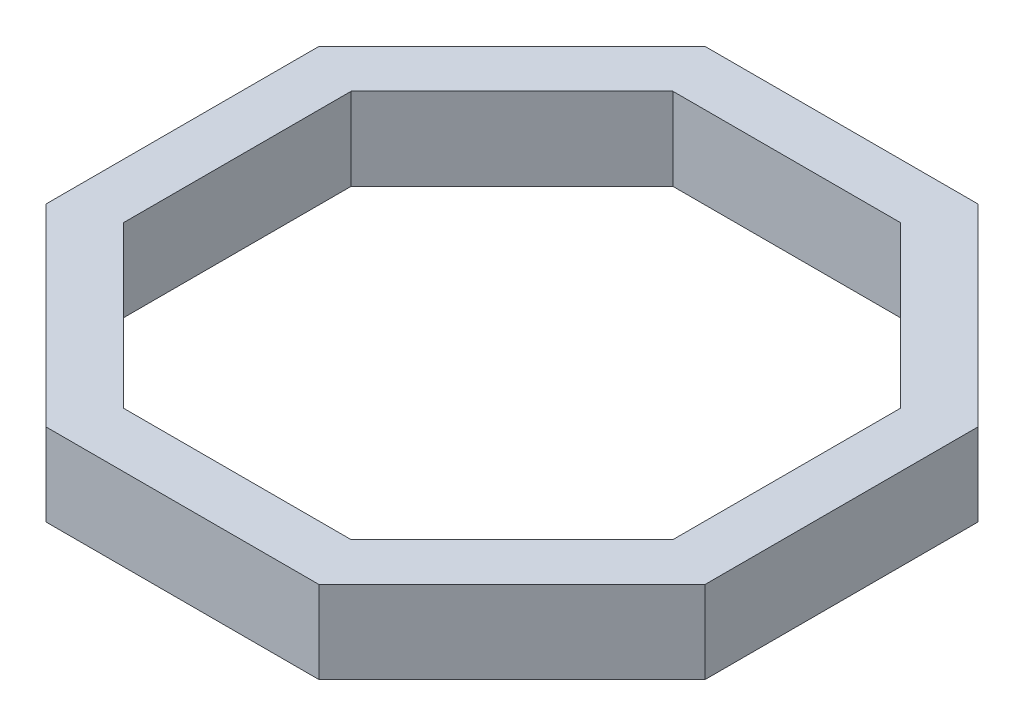
ISO-10303-21;
HEADER;
FILE_DESCRIPTION(('STEP AP214'),'2;1');
FILE_NAME('part.step','',(''),(''),'','','');
FILE_SCHEMA(('AUTOMOTIVE_DESIGN { 1 0 10303 214 1 1 1 1 }'));
ENDSEC;
DATA;
#1=APPLICATION_CONTEXT('core data for automotive mechanical design processes');
#2=APPLICATION_PROTOCOL_DEFINITION('international standard','automotive_design',2000,#1);
#3=PRODUCT_CONTEXT('',#1,'mechanical');
#4=PRODUCT('Part','Part','',(#3));
#5=PRODUCT_RELATED_PRODUCT_CATEGORY('part','',(#4));
#6=PRODUCT_DEFINITION_FORMATION('','',#4);
#7=PRODUCT_DEFINITION_CONTEXT('part definition',#1,'design');
#8=PRODUCT_DEFINITION('design','',#6,#7);
#9=PRODUCT_DEFINITION_SHAPE('','',#8);
#10=(LENGTH_UNIT() NAMED_UNIT(*) SI_UNIT(.MILLI.,.METRE.));
#11=(NAMED_UNIT(*) PLANE_ANGLE_UNIT() SI_UNIT($,.RADIAN.));
#12=(NAMED_UNIT(*) SI_UNIT($,.STERADIAN.) SOLID_ANGLE_UNIT());
#13=UNCERTAINTY_MEASURE_WITH_UNIT(LENGTH_MEASURE(1.E-05),#10,'distance_accuracy_value','');
#14=(GEOMETRIC_REPRESENTATION_CONTEXT(3) GLOBAL_UNCERTAINTY_ASSIGNED_CONTEXT((#13)) GLOBAL_UNIT_ASSIGNED_CONTEXT((#10,
#11,#12)) REPRESENTATION_CONTEXT('',''));
#15=CARTESIAN_POINT('',(0.,0.,0.));
#16=DIRECTION('',(0.,0.,1.));
#17=DIRECTION('',(1.,0.,0.));
#18=AXIS2_PLACEMENT_3D('',#15,#16,#17);
#19=CARTESIAN_POINT('',(120.,30.,49.7056274847712));
#20=DIRECTION('',(-1.,0.,0.));
#21=DIRECTION('',(0.,0.,1.));
#22=AXIS2_PLACEMENT_3D('',#19,#20,#21);
#23=PLANE('',#22);
#24=DIRECTION('',(0.,0.,-1.));
#25=VECTOR('',#24,1.);
#26=CARTESIAN_POINT('',(120.,0.,49.7056274847712));
#27=LINE('',#26,#25);
#28=CARTESIAN_POINT('',(120.,0.,49.7056274847712));
#29=VERTEX_POINT('',#28);
#30=CARTESIAN_POINT('',(120.,0.,-49.7056274847715));
#31=VERTEX_POINT('',#30);
#32=EDGE_CURVE('E204',#29,#31,#27,.T.);
#33=ORIENTED_EDGE('',*,*,#32,.T.);
#34=DIRECTION('',(0.,-1.,0.));
#35=VECTOR('',#34,1.);
#36=CARTESIAN_POINT('',(120.,30.,-49.7056274847715));
#37=LINE('',#36,#35);
#38=CARTESIAN_POINT('',(120.,30.,-49.7056274847715));
#39=VERTEX_POINT('',#38);
#40=EDGE_CURVE('E11',#39,#31,#37,.T.);
#41=ORIENTED_EDGE('',*,*,#40,.F.);
#42=DIRECTION('',(0.,0.,-1.));
#43=VECTOR('',#42,1.);
#44=CARTESIAN_POINT('',(120.,30.,49.7056274847712));
#45=LINE('',#44,#43);
#46=CARTESIAN_POINT('',(120.,30.,49.7056274847712));
#47=VERTEX_POINT('',#46);
#48=EDGE_CURVE('E216',#47,#39,#45,.T.);
#49=ORIENTED_EDGE('',*,*,#48,.F.);
#50=DIRECTION('',(0.,-1.,0.));
#51=VECTOR('',#50,1.);
#52=CARTESIAN_POINT('',(120.,30.,49.7056274847712));
#53=LINE('',#52,#51);
#54=EDGE_CURVE('E234',#47,#29,#53,.T.);
#55=ORIENTED_EDGE('',*,*,#54,.T.);
#56=EDGE_LOOP('',(#33,#41,#49,#55));
#57=FACE_BOUND('',#56,.T.);
#58=ADVANCED_FACE('F35',(#57),#23,.F.);
#59=CARTESIAN_POINT('',(120.,30.,-49.7056274847715));
#60=DIRECTION('',(-0.707106781186546,0.,0.707106781186549));
#61=DIRECTION('',(0.707106781186549,0.,0.707106781186546));
#62=AXIS2_PLACEMENT_3D('',#59,#60,#61);
#63=PLANE('',#62);
#64=DIRECTION('',(-0.707106781186549,0.,-0.707106781186546));
#65=VECTOR('',#64,1.);
#66=CARTESIAN_POINT('',(120.,0.,-49.7056274847715));
#67=LINE('',#66,#65);
#68=CARTESIAN_POINT('',(49.7056274847711,0.,-120.));
#69=VERTEX_POINT('',#68);
#70=EDGE_CURVE('E237',#31,#69,#67,.T.);
#71=ORIENTED_EDGE('',*,*,#70,.T.);
#72=DIRECTION('',(0.,-1.,0.));
#73=VECTOR('',#72,1.);
#74=CARTESIAN_POINT('',(49.7056274847711,30.,-120.));
#75=LINE('',#74,#73);
#76=CARTESIAN_POINT('',(49.7056274847711,30.,-120.));
#77=VERTEX_POINT('',#76);
#78=EDGE_CURVE('E42',#77,#69,#75,.T.);
#79=ORIENTED_EDGE('',*,*,#78,.F.);
#80=DIRECTION('',(-0.707106781186549,0.,-0.707106781186546));
#81=VECTOR('',#80,1.);
#82=CARTESIAN_POINT('',(120.,30.,-49.7056274847715));
#83=LINE('',#82,#81);
#84=EDGE_CURVE('E219',#39,#77,#83,.T.);
#85=ORIENTED_EDGE('',*,*,#84,.F.);
#86=ORIENTED_EDGE('',*,*,#40,.T.);
#87=EDGE_LOOP('',(#71,#79,#85,#86));
#88=FACE_BOUND('',#87,.T.);
#89=ADVANCED_FACE('F292',(#88),#63,.F.);
#90=CARTESIAN_POINT('',(49.7056274847711,30.,-120.));
#91=DIRECTION('',(0.,0.,1.));
#92=DIRECTION('',(1.,0.,0.));
#93=AXIS2_PLACEMENT_3D('',#90,#91,#92);
#94=PLANE('',#93);
#95=DIRECTION('',(-1.,0.,0.));
#96=VECTOR('',#95,1.);
#97=CARTESIAN_POINT('',(49.7056274847711,0.,-120.));
#98=LINE('',#97,#96);
#99=CARTESIAN_POINT('',(-49.7056274847715,0.,-120.));
#100=VERTEX_POINT('',#99);
#101=EDGE_CURVE('E239',#69,#100,#98,.T.);
#102=ORIENTED_EDGE('',*,*,#101,.T.);
#103=DIRECTION('',(0.,-1.,0.));
#104=VECTOR('',#103,1.);
#105=CARTESIAN_POINT('',(-49.7056274847715,30.,-120.));
#106=LINE('',#105,#104);
#107=CARTESIAN_POINT('',(-49.7056274847715,30.,-120.));
#108=VERTEX_POINT('',#107);
#109=EDGE_CURVE('E264',#108,#100,#106,.T.);
#110=ORIENTED_EDGE('',*,*,#109,.F.);
#111=DIRECTION('',(-1.,0.,0.));
#112=VECTOR('',#111,1.);
#113=CARTESIAN_POINT('',(49.7056274847711,30.,-120.));
#114=LINE('',#113,#112);
#115=EDGE_CURVE('E222',#77,#108,#114,.T.);
#116=ORIENTED_EDGE('',*,*,#115,.F.);
#117=ORIENTED_EDGE('',*,*,#78,.T.);
#118=EDGE_LOOP('',(#102,#110,#116,#117));
#119=FACE_BOUND('',#118,.T.);
#120=ADVANCED_FACE('F271',(#119),#94,.F.);
#121=CARTESIAN_POINT('',(-49.7056274847715,30.,-120.));
#122=DIRECTION('',(0.707106781186548,0.,0.707106781186547));
#123=DIRECTION('',(0.707106781186547,0.,-0.707106781186548));
#124=AXIS2_PLACEMENT_3D('',#121,#122,#123);
#125=PLANE('',#124);
#126=DIRECTION('',(-0.707106781186547,0.,0.707106781186549));
#127=VECTOR('',#126,1.);
#128=CARTESIAN_POINT('',(-49.7056274847715,0.,-120.));
#129=LINE('',#128,#127);
#130=CARTESIAN_POINT('',(-120.,0.,-49.7056274847711));
#131=VERTEX_POINT('',#130);
#132=EDGE_CURVE('E241',#100,#131,#129,.T.);
#133=ORIENTED_EDGE('',*,*,#132,.T.);
#134=DIRECTION('',(0.,-1.,0.));
#135=VECTOR('',#134,1.);
#136=CARTESIAN_POINT('',(-120.,30.,-49.7056274847711));
#137=LINE('',#136,#135);
#138=CARTESIAN_POINT('',(-120.,30.,-49.7056274847711));
#139=VERTEX_POINT('',#138);
#140=EDGE_CURVE('E261',#139,#131,#137,.T.);
#141=ORIENTED_EDGE('',*,*,#140,.F.);
#142=DIRECTION('',(-0.707106781186547,0.,0.707106781186549));
#143=VECTOR('',#142,1.);
#144=CARTESIAN_POINT('',(-49.7056274847715,30.,-120.));
#145=LINE('',#144,#143);
#146=EDGE_CURVE('E224',#108,#139,#145,.T.);
#147=ORIENTED_EDGE('',*,*,#146,.F.);
#148=ORIENTED_EDGE('',*,*,#109,.T.);
#149=EDGE_LOOP('',(#133,#141,#147,#148));
#150=FACE_BOUND('',#149,.T.);
#151=ADVANCED_FACE('F280',(#150),#125,.F.);
#152=CARTESIAN_POINT('',(-120.,30.,-49.7056274847711));
#153=DIRECTION('',(1.,0.,0.));
#154=DIRECTION('',(0.,0.,-1.));
#155=AXIS2_PLACEMENT_3D('',#152,#153,#154);
#156=PLANE('',#155);
#157=DIRECTION('',(0.,0.,1.));
#158=VECTOR('',#157,1.);
#159=CARTESIAN_POINT('',(-120.,0.,-49.7056274847711));
#160=LINE('',#159,#158);
#161=CARTESIAN_POINT('',(-120.,0.,49.7056274847715));
#162=VERTEX_POINT('',#161);
#163=EDGE_CURVE('E243',#131,#162,#160,.T.);
#164=ORIENTED_EDGE('',*,*,#163,.T.);
#165=DIRECTION('',(0.,-1.,0.));
#166=VECTOR('',#165,1.);
#167=CARTESIAN_POINT('',(-120.,30.,49.7056274847715));
#168=LINE('',#167,#166);
#169=CARTESIAN_POINT('',(-120.,30.,49.7056274847715));
#170=VERTEX_POINT('',#169);
#171=EDGE_CURVE('E258',#170,#162,#168,.T.);
#172=ORIENTED_EDGE('',*,*,#171,.F.);
#173=DIRECTION('',(0.,0.,1.));
#174=VECTOR('',#173,1.);
#175=CARTESIAN_POINT('',(-120.,30.,-49.7056274847711));
#176=LINE('',#175,#174);
#177=EDGE_CURVE('E226',#139,#170,#176,.T.);
#178=ORIENTED_EDGE('',*,*,#177,.F.);
#179=ORIENTED_EDGE('',*,*,#140,.T.);
#180=EDGE_LOOP('',(#164,#172,#178,#179));
#181=FACE_BOUND('',#180,.T.);
#182=ADVANCED_FACE('F284',(#181),#156,.F.);
#183=CARTESIAN_POINT('',(-120.,30.,49.7056274847715));
#184=DIRECTION('',(0.707106781186547,0.,-0.707106781186549));
#185=DIRECTION('',(-0.707106781186549,0.,-0.707106781186547));
#186=AXIS2_PLACEMENT_3D('',#183,#184,#185);
#187=PLANE('',#186);
#188=DIRECTION('',(0.707106781186548,0.,0.707106781186547));
#189=VECTOR('',#188,1.);
#190=CARTESIAN_POINT('',(-120.,0.,49.7056274847715));
#191=LINE('',#190,#189);
#192=CARTESIAN_POINT('',(-49.7056274847711,0.,120.));
#193=VERTEX_POINT('',#192);
#194=EDGE_CURVE('E245',#162,#193,#191,.T.);
#195=ORIENTED_EDGE('',*,*,#194,.T.);
#196=DIRECTION('',(0.,-1.,0.));
#197=VECTOR('',#196,1.);
#198=CARTESIAN_POINT('',(-49.7056274847711,30.,120.));
#199=LINE('',#198,#197);
#200=CARTESIAN_POINT('',(-49.7056274847711,30.,120.));
#201=VERTEX_POINT('',#200);
#202=EDGE_CURVE('E255',#201,#193,#199,.T.);
#203=ORIENTED_EDGE('',*,*,#202,.F.);
#204=DIRECTION('',(0.707106781186548,0.,0.707106781186547));
#205=VECTOR('',#204,1.);
#206=CARTESIAN_POINT('',(-120.,30.,49.7056274847715));
#207=LINE('',#206,#205);
#208=EDGE_CURVE('E228',#170,#201,#207,.T.);
#209=ORIENTED_EDGE('',*,*,#208,.F.);
#210=ORIENTED_EDGE('',*,*,#171,.T.);
#211=EDGE_LOOP('',(#195,#203,#209,#210));
#212=FACE_BOUND('',#211,.T.);
#213=ADVANCED_FACE('F305',(#212),#187,.F.);
#214=CARTESIAN_POINT('',(-49.7056274847711,30.,120.));
#215=DIRECTION('',(0.,0.,-1.));
#216=DIRECTION('',(-1.,0.,0.));
#217=AXIS2_PLACEMENT_3D('',#214,#215,#216);
#218=PLANE('',#217);
#219=DIRECTION('',(1.,0.,0.));
#220=VECTOR('',#219,1.);
#221=CARTESIAN_POINT('',(-49.7056274847711,0.,120.));
#222=LINE('',#221,#220);
#223=CARTESIAN_POINT('',(49.7056274847715,0.,120.));
#224=VERTEX_POINT('',#223);
#225=EDGE_CURVE('E247',#193,#224,#222,.T.);
#226=ORIENTED_EDGE('',*,*,#225,.T.);
#227=DIRECTION('',(0.,-1.,0.));
#228=VECTOR('',#227,1.);
#229=CARTESIAN_POINT('',(49.7056274847715,30.,120.));
#230=LINE('',#229,#228);
#231=CARTESIAN_POINT('',(49.7056274847715,30.,120.));
#232=VERTEX_POINT('',#231);
#233=EDGE_CURVE('E252',#232,#224,#230,.T.);
#234=ORIENTED_EDGE('',*,*,#233,.F.);
#235=DIRECTION('',(1.,0.,0.));
#236=VECTOR('',#235,1.);
#237=CARTESIAN_POINT('',(-49.7056274847711,30.,120.));
#238=LINE('',#237,#236);
#239=EDGE_CURVE('E230',#201,#232,#238,.T.);
#240=ORIENTED_EDGE('',*,*,#239,.F.);
#241=ORIENTED_EDGE('',*,*,#202,.T.);
#242=EDGE_LOOP('',(#226,#234,#240,#241));
#243=FACE_BOUND('',#242,.T.);
#244=ADVANCED_FACE('F303',(#243),#218,.F.);
#245=CARTESIAN_POINT('',(49.7056274847715,30.,120.));
#246=DIRECTION('',(-0.707106781186548,0.,-0.707106781186547));
#247=DIRECTION('',(-0.707106781186547,0.,0.707106781186548));
#248=AXIS2_PLACEMENT_3D('',#245,#246,#247);
#249=PLANE('',#248);
#250=DIRECTION('',(0.707106781186547,0.,-0.707106781186548));
#251=VECTOR('',#250,1.);
#252=CARTESIAN_POINT('',(49.7056274847715,0.,120.));
#253=LINE('',#252,#251);
#254=EDGE_CURVE('E220',#224,#29,#253,.T.);
#255=ORIENTED_EDGE('',*,*,#254,.T.);
#256=ORIENTED_EDGE('',*,*,#54,.F.);
#257=DIRECTION('',(0.707106781186547,0.,-0.707106781186548));
#258=VECTOR('',#257,1.);
#259=CARTESIAN_POINT('',(49.7056274847715,30.,120.));
#260=LINE('',#259,#258);
#261=EDGE_CURVE('E232',#232,#47,#260,.T.);
#262=ORIENTED_EDGE('',*,*,#261,.F.);
#263=ORIENTED_EDGE('',*,*,#233,.T.);
#264=EDGE_LOOP('',(#255,#256,#262,#263));
#265=FACE_BOUND('',#264,.T.);
#266=ADVANCED_FACE('F298',(#265),#249,.F.);
#267=CARTESIAN_POINT('',(0.,30.,0.));
#268=DIRECTION('',(0.,1.,0.));
#269=DIRECTION('',(0.,0.,1.));
#270=AXIS2_PLACEMENT_3D('',#267,#268,#269);
#271=PLANE('',#270);
#272=DIRECTION('',(0.,0.,-1.));
#273=VECTOR('',#272,1.);
#274=CARTESIAN_POINT('',(99.9999999999998,30.,41.4213562373093));
#275=LINE('',#274,#273);
#276=CARTESIAN_POINT('',(99.9999999999998,30.,41.4213562373093));
#277=VERTEX_POINT('',#276);
#278=CARTESIAN_POINT('',(99.9999999999997,30.,-41.4213562373095));
#279=VERTEX_POINT('',#278);
#280=EDGE_CURVE('E49',#277,#279,#275,.T.);
#281=ORIENTED_EDGE('',*,*,#280,.F.);
#282=DIRECTION('',(0.707106781186547,0.,-0.707106781186548));
#283=VECTOR('',#282,1.);
#284=CARTESIAN_POINT('',(41.4213562373095,30.,99.9999999999997));
#285=LINE('',#284,#283);
#286=CARTESIAN_POINT('',(41.4213562373095,30.,99.9999999999997));
#287=VERTEX_POINT('',#286);
#288=EDGE_CURVE('E166',#287,#277,#285,.T.);
#289=ORIENTED_EDGE('',*,*,#288,.F.);
#290=DIRECTION('',(1.,0.,0.));
#291=VECTOR('',#290,1.);
#292=CARTESIAN_POINT('',(-41.4213562373093,30.,99.9999999999998));
#293=LINE('',#292,#291);
#294=CARTESIAN_POINT('',(-41.4213562373093,30.,99.9999999999998));
#295=VERTEX_POINT('',#294);
#296=EDGE_CURVE('E169',#295,#287,#293,.T.);
#297=ORIENTED_EDGE('',*,*,#296,.F.);
#298=DIRECTION('',(0.707106781186548,0.,0.707106781186547));
#299=VECTOR('',#298,1.);
#300=CARTESIAN_POINT('',(-99.9999999999997,30.,41.4213562373095));
#301=LINE('',#300,#299);
#302=CARTESIAN_POINT('',(-99.9999999999997,30.,41.4213562373095));
#303=VERTEX_POINT('',#302);
#304=EDGE_CURVE('E197',#303,#295,#301,.T.);
#305=ORIENTED_EDGE('',*,*,#304,.F.);
#306=DIRECTION('',(0.,0.,1.));
#307=VECTOR('',#306,1.);
#308=CARTESIAN_POINT('',(-99.9999999999998,30.,-41.4213562373093));
#309=LINE('',#308,#307);
#310=CARTESIAN_POINT('',(-99.9999999999998,30.,-41.4213562373093));
#311=VERTEX_POINT('',#310);
#312=EDGE_CURVE('E194',#311,#303,#309,.T.);
#313=ORIENTED_EDGE('',*,*,#312,.F.);
#314=DIRECTION('',(-0.707106781186547,0.,0.707106781186548));
#315=VECTOR('',#314,1.);
#316=CARTESIAN_POINT('',(-41.4213562373095,30.,-99.9999999999997));
#317=LINE('',#316,#315);
#318=CARTESIAN_POINT('',(-41.4213562373095,30.,-99.9999999999997));
#319=VERTEX_POINT('',#318);
#320=EDGE_CURVE('E191',#319,#311,#317,.T.);
#321=ORIENTED_EDGE('',*,*,#320,.F.);
#322=DIRECTION('',(-1.,0.,0.));
#323=VECTOR('',#322,1.);
#324=CARTESIAN_POINT('',(41.4213562373093,30.,-99.9999999999998));
#325=LINE('',#324,#323);
#326=CARTESIAN_POINT('',(41.4213562373093,30.,-99.9999999999998));
#327=VERTEX_POINT('',#326);
#328=EDGE_CURVE('E188',#327,#319,#325,.T.);
#329=ORIENTED_EDGE('',*,*,#328,.F.);
#330=DIRECTION('',(-0.707106781186548,0.,-0.707106781186547));
#331=VECTOR('',#330,1.);
#332=CARTESIAN_POINT('',(99.9999999999997,30.,-41.4213562373095));
#333=LINE('',#332,#331);
#334=EDGE_CURVE('E186',#279,#327,#333,.T.);
#335=ORIENTED_EDGE('',*,*,#334,.F.);
#336=EDGE_LOOP('',(#281,#289,#297,#305,#313,#321,#329,#335));
#337=FACE_BOUND('',#336,.T.);
#338=ORIENTED_EDGE('',*,*,#48,.T.);
#339=ORIENTED_EDGE('',*,*,#84,.T.);
#340=ORIENTED_EDGE('',*,*,#115,.T.);
#341=ORIENTED_EDGE('',*,*,#146,.T.);
#342=ORIENTED_EDGE('',*,*,#177,.T.);
#343=ORIENTED_EDGE('',*,*,#208,.T.);
#344=ORIENTED_EDGE('',*,*,#239,.T.);
#345=ORIENTED_EDGE('',*,*,#261,.T.);
#346=EDGE_LOOP('',(#338,#339,#340,#341,#342,#343,#344,#345));
#347=FACE_BOUND('',#346,.T.);
#348=ADVANCED_FACE('F288',(#337,#347),#271,.T.);
#349=CARTESIAN_POINT('',(0.,0.,0.));
#350=DIRECTION('',(0.,1.,0.));
#351=DIRECTION('',(0.,0.,1.));
#352=AXIS2_PLACEMENT_3D('',#349,#350,#351);
#353=PLANE('',#352);
#354=DIRECTION('',(0.707106781186547,0.,-0.707106781186548));
#355=VECTOR('',#354,1.);
#356=CARTESIAN_POINT('',(41.4213562373095,0.,99.9999999999997));
#357=LINE('',#356,#355);
#358=CARTESIAN_POINT('',(41.4213562373095,0.,99.9999999999997));
#359=VERTEX_POINT('',#358);
#360=CARTESIAN_POINT('',(99.9999999999998,0.,41.4213562373093));
#361=VERTEX_POINT('',#360);
#362=EDGE_CURVE('E155',#359,#361,#357,.T.);
#363=ORIENTED_EDGE('',*,*,#362,.T.);
#364=DIRECTION('',(0.,0.,-1.));
#365=VECTOR('',#364,1.);
#366=CARTESIAN_POINT('',(99.9999999999998,0.,41.4213562373093));
#367=LINE('',#366,#365);
#368=CARTESIAN_POINT('',(99.9999999999997,0.,-41.4213562373095));
#369=VERTEX_POINT('',#368);
#370=EDGE_CURVE('E149',#361,#369,#367,.T.);
#371=ORIENTED_EDGE('',*,*,#370,.T.);
#372=DIRECTION('',(-0.707106781186548,0.,-0.707106781186547));
#373=VECTOR('',#372,1.);
#374=CARTESIAN_POINT('',(99.9999999999997,0.,-41.4213562373095));
#375=LINE('',#374,#373);
#376=CARTESIAN_POINT('',(41.4213562373093,0.,-99.9999999999998));
#377=VERTEX_POINT('',#376);
#378=EDGE_CURVE('E158',#369,#377,#375,.T.);
#379=ORIENTED_EDGE('',*,*,#378,.T.);
#380=DIRECTION('',(-1.,0.,0.));
#381=VECTOR('',#380,1.);
#382=CARTESIAN_POINT('',(41.4213562373093,0.,-99.9999999999998));
#383=LINE('',#382,#381);
#384=CARTESIAN_POINT('',(-41.4213562373095,0.,-99.9999999999997));
#385=VERTEX_POINT('',#384);
#386=EDGE_CURVE('E57',#377,#385,#383,.T.);
#387=ORIENTED_EDGE('',*,*,#386,.T.);
#388=DIRECTION('',(-0.707106781186547,0.,0.707106781186548));
#389=VECTOR('',#388,1.);
#390=CARTESIAN_POINT('',(-41.4213562373095,0.,-99.9999999999997));
#391=LINE('',#390,#389);
#392=CARTESIAN_POINT('',(-99.9999999999998,0.,-41.4213562373093));
#393=VERTEX_POINT('',#392);
#394=EDGE_CURVE('E173',#385,#393,#391,.T.);
#395=ORIENTED_EDGE('',*,*,#394,.T.);
#396=DIRECTION('',(0.,0.,1.));
#397=VECTOR('',#396,1.);
#398=CARTESIAN_POINT('',(-99.9999999999998,0.,-41.4213562373093));
#399=LINE('',#398,#397);
#400=CARTESIAN_POINT('',(-99.9999999999997,0.,41.4213562373095));
#401=VERTEX_POINT('',#400);
#402=EDGE_CURVE('E176',#393,#401,#399,.T.);
#403=ORIENTED_EDGE('',*,*,#402,.T.);
#404=DIRECTION('',(0.707106781186548,0.,0.707106781186547));
#405=VECTOR('',#404,1.);
#406=CARTESIAN_POINT('',(-99.9999999999997,0.,41.4213562373095));
#407=LINE('',#406,#405);
#408=CARTESIAN_POINT('',(-41.4213562373093,0.,99.9999999999998));
#409=VERTEX_POINT('',#408);
#410=EDGE_CURVE('E179',#401,#409,#407,.T.);
#411=ORIENTED_EDGE('',*,*,#410,.T.);
#412=DIRECTION('',(1.,0.,0.));
#413=VECTOR('',#412,1.);
#414=CARTESIAN_POINT('',(-41.4213562373093,0.,99.9999999999998));
#415=LINE('',#414,#413);
#416=EDGE_CURVE('E182',#409,#359,#415,.T.);
#417=ORIENTED_EDGE('',*,*,#416,.T.);
#418=EDGE_LOOP('',(#363,#371,#379,#387,#395,#403,#411,#417));
#419=FACE_BOUND('',#418,.T.);
#420=ORIENTED_EDGE('',*,*,#32,.F.);
#421=ORIENTED_EDGE('',*,*,#254,.F.);
#422=ORIENTED_EDGE('',*,*,#225,.F.);
#423=ORIENTED_EDGE('',*,*,#194,.F.);
#424=ORIENTED_EDGE('',*,*,#163,.F.);
#425=ORIENTED_EDGE('',*,*,#132,.F.);
#426=ORIENTED_EDGE('',*,*,#101,.F.);
#427=ORIENTED_EDGE('',*,*,#70,.F.);
#428=EDGE_LOOP('',(#420,#421,#422,#423,#424,#425,#426,#427));
#429=FACE_BOUND('',#428,.T.);
#430=ADVANCED_FACE('F162',(#419,#429),#353,.F.);
#431=CARTESIAN_POINT('',(99.9999999999998,0.,41.4213562373093));
#432=DIRECTION('',(1.,0.,0.));
#433=DIRECTION('',(0.,0.,-1.));
#434=AXIS2_PLACEMENT_3D('',#431,#432,#433);
#435=PLANE('',#434);
#436=ORIENTED_EDGE('',*,*,#280,.T.);
#437=DIRECTION('',(0.,1.,0.));
#438=VECTOR('',#437,1.);
#439=CARTESIAN_POINT('',(99.9999999999997,0.,-41.4213562373095));
#440=LINE('',#439,#438);
#441=EDGE_CURVE('E145',#369,#279,#440,.T.);
#442=ORIENTED_EDGE('',*,*,#441,.F.);
#443=ORIENTED_EDGE('',*,*,#370,.F.);
#444=DIRECTION('',(0.,1.,0.));
#445=VECTOR('',#444,1.);
#446=CARTESIAN_POINT('',(99.9999999999998,0.,41.4213562373093));
#447=LINE('',#446,#445);
#448=EDGE_CURVE('E202',#361,#277,#447,.T.);
#449=ORIENTED_EDGE('',*,*,#448,.T.);
#450=EDGE_LOOP('',(#436,#442,#443,#449));
#451=FACE_BOUND('',#450,.T.);
#452=ADVANCED_FACE('F147',(#451),#435,.F.);
#453=CARTESIAN_POINT('',(41.4213562373095,0.,99.9999999999997));
#454=DIRECTION('',(0.707106781186548,0.,0.707106781186547));
#455=DIRECTION('',(0.707106781186547,0.,-0.707106781186548));
#456=AXIS2_PLACEMENT_3D('',#453,#454,#455);
#457=PLANE('',#456);
#458=ORIENTED_EDGE('',*,*,#288,.T.);
#459=ORIENTED_EDGE('',*,*,#448,.F.);
#460=ORIENTED_EDGE('',*,*,#362,.F.);
#461=DIRECTION('',(0.,1.,0.));
#462=VECTOR('',#461,1.);
#463=CARTESIAN_POINT('',(41.4213562373095,0.,99.9999999999997));
#464=LINE('',#463,#462);
#465=EDGE_CURVE('E205',#359,#287,#464,.T.);
#466=ORIENTED_EDGE('',*,*,#465,.T.);
#467=EDGE_LOOP('',(#458,#459,#460,#466));
#468=FACE_BOUND('',#467,.T.);
#469=ADVANCED_FACE('F376',(#468),#457,.F.);
#470=CARTESIAN_POINT('',(-41.4213562373093,0.,99.9999999999998));
#471=DIRECTION('',(0.,0.,1.));
#472=DIRECTION('',(1.,0.,0.));
#473=AXIS2_PLACEMENT_3D('',#470,#471,#472);
#474=PLANE('',#473);
#475=ORIENTED_EDGE('',*,*,#296,.T.);
#476=ORIENTED_EDGE('',*,*,#465,.F.);
#477=ORIENTED_EDGE('',*,*,#416,.F.);
#478=DIRECTION('',(0.,1.,0.));
#479=VECTOR('',#478,1.);
#480=CARTESIAN_POINT('',(-41.4213562373093,0.,99.9999999999998));
#481=LINE('',#480,#479);
#482=EDGE_CURVE('E207',#409,#295,#481,.T.);
#483=ORIENTED_EDGE('',*,*,#482,.T.);
#484=EDGE_LOOP('',(#475,#476,#477,#483));
#485=FACE_BOUND('',#484,.T.);
#486=ADVANCED_FACE('F385',(#485),#474,.F.);
#487=CARTESIAN_POINT('',(-99.9999999999997,0.,41.4213562373095));
#488=DIRECTION('',(-0.707106781186547,0.,0.707106781186548));
#489=DIRECTION('',(0.707106781186548,0.,0.707106781186547));
#490=AXIS2_PLACEMENT_3D('',#487,#488,#489);
#491=PLANE('',#490);
#492=ORIENTED_EDGE('',*,*,#304,.T.);
#493=ORIENTED_EDGE('',*,*,#482,.F.);
#494=ORIENTED_EDGE('',*,*,#410,.F.);
#495=DIRECTION('',(0.,1.,0.));
#496=VECTOR('',#495,1.);
#497=CARTESIAN_POINT('',(-99.9999999999997,0.,41.4213562373095));
#498=LINE('',#497,#496);
#499=EDGE_CURVE('E209',#401,#303,#498,.T.);
#500=ORIENTED_EDGE('',*,*,#499,.T.);
#501=EDGE_LOOP('',(#492,#493,#494,#500));
#502=FACE_BOUND('',#501,.T.);
#503=ADVANCED_FACE('F395',(#502),#491,.F.);
#504=CARTESIAN_POINT('',(-99.9999999999998,0.,-41.4213562373093));
#505=DIRECTION('',(-1.,0.,0.));
#506=DIRECTION('',(0.,0.,1.));
#507=AXIS2_PLACEMENT_3D('',#504,#505,#506);
#508=PLANE('',#507);
#509=ORIENTED_EDGE('',*,*,#312,.T.);
#510=ORIENTED_EDGE('',*,*,#499,.F.);
#511=ORIENTED_EDGE('',*,*,#402,.F.);
#512=DIRECTION('',(0.,1.,0.));
#513=VECTOR('',#512,1.);
#514=CARTESIAN_POINT('',(-99.9999999999998,0.,-41.4213562373093));
#515=LINE('',#514,#513);
#516=EDGE_CURVE('E211',#393,#311,#515,.T.);
#517=ORIENTED_EDGE('',*,*,#516,.T.);
#518=EDGE_LOOP('',(#509,#510,#511,#517));
#519=FACE_BOUND('',#518,.T.);
#520=ADVANCED_FACE('F405',(#519),#508,.F.);
#521=CARTESIAN_POINT('',(-41.4213562373095,0.,-99.9999999999997));
#522=DIRECTION('',(-0.707106781186548,0.,-0.707106781186547));
#523=DIRECTION('',(-0.707106781186547,0.,0.707106781186548));
#524=AXIS2_PLACEMENT_3D('',#521,#522,#523);
#525=PLANE('',#524);
#526=ORIENTED_EDGE('',*,*,#320,.T.);
#527=ORIENTED_EDGE('',*,*,#516,.F.);
#528=ORIENTED_EDGE('',*,*,#394,.F.);
#529=DIRECTION('',(0.,1.,0.));
#530=VECTOR('',#529,1.);
#531=CARTESIAN_POINT('',(-41.4213562373095,0.,-99.9999999999997));
#532=LINE('',#531,#530);
#533=EDGE_CURVE('E213',#385,#319,#532,.T.);
#534=ORIENTED_EDGE('',*,*,#533,.T.);
#535=EDGE_LOOP('',(#526,#527,#528,#534));
#536=FACE_BOUND('',#535,.T.);
#537=ADVANCED_FACE('F415',(#536),#525,.F.);
#538=CARTESIAN_POINT('',(41.4213562373093,0.,-99.9999999999998));
#539=DIRECTION('',(0.,0.,-1.));
#540=DIRECTION('',(-1.,0.,0.));
#541=AXIS2_PLACEMENT_3D('',#538,#539,#540);
#542=PLANE('',#541);
#543=ORIENTED_EDGE('',*,*,#328,.T.);
#544=ORIENTED_EDGE('',*,*,#533,.F.);
#545=ORIENTED_EDGE('',*,*,#386,.F.);
#546=DIRECTION('',(0.,1.,0.));
#547=VECTOR('',#546,1.);
#548=CARTESIAN_POINT('',(41.4213562373093,0.,-99.9999999999998));
#549=LINE('',#548,#547);
#550=EDGE_CURVE('E154',#377,#327,#549,.T.);
#551=ORIENTED_EDGE('',*,*,#550,.T.);
#552=EDGE_LOOP('',(#543,#544,#545,#551));
#553=FACE_BOUND('',#552,.T.);
#554=ADVANCED_FACE('F425',(#553),#542,.F.);
#555=CARTESIAN_POINT('',(99.9999999999997,0.,-41.4213562373095));
#556=DIRECTION('',(0.707106781186547,0.,-0.707106781186548));
#557=DIRECTION('',(-0.707106781186548,0.,-0.707106781186547));
#558=AXIS2_PLACEMENT_3D('',#555,#556,#557);
#559=PLANE('',#558);
#560=ORIENTED_EDGE('',*,*,#334,.T.);
#561=ORIENTED_EDGE('',*,*,#550,.F.);
#562=ORIENTED_EDGE('',*,*,#378,.F.);
#563=ORIENTED_EDGE('',*,*,#441,.T.);
#564=EDGE_LOOP('',(#560,#561,#562,#563));
#565=FACE_BOUND('',#564,.T.);
#566=ADVANCED_FACE('F159',(#565),#559,.F.);
#567=CLOSED_SHELL('',(#58,#89,#120,#151,#182,#213,#244,#266,#348,#430,#452,#469,#486,#503,#520,
#537,#554,#566));
#568=MANIFOLD_SOLID_BREP('B2',#567);
#569=ADVANCED_BREP_SHAPE_REPRESENTATION('',(#18,#568),#14);
#570=SHAPE_DEFINITION_REPRESENTATION(#9,#569);
ENDSEC;
END-ISO-10303-21;
